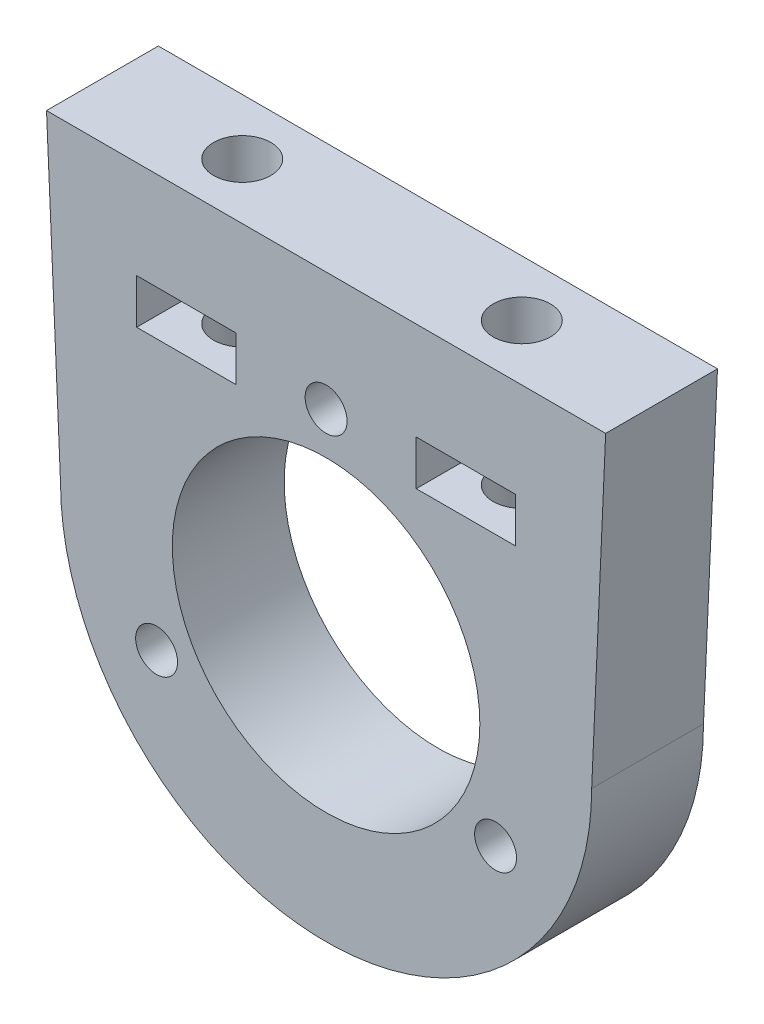
ISO-10303-21;
HEADER;
FILE_DESCRIPTION(('STEP AP214'),'2;1');
FILE_NAME('part.step','',(''),(''),'','','');
FILE_SCHEMA(('AUTOMOTIVE_DESIGN { 1 0 10303 214 1 1 1 1 }'));
ENDSEC;
DATA;
#1=APPLICATION_CONTEXT('core data for automotive mechanical design processes');
#2=APPLICATION_PROTOCOL_DEFINITION('international standard','automotive_design',2000,#1);
#3=PRODUCT_CONTEXT('',#1,'mechanical');
#4=PRODUCT('Part','Part','',(#3));
#5=PRODUCT_RELATED_PRODUCT_CATEGORY('part','',(#4));
#6=PRODUCT_DEFINITION_FORMATION('','',#4);
#7=PRODUCT_DEFINITION_CONTEXT('part definition',#1,'design');
#8=PRODUCT_DEFINITION('design','',#6,#7);
#9=PRODUCT_DEFINITION_SHAPE('','',#8);
#10=(LENGTH_UNIT() NAMED_UNIT(*) SI_UNIT(.MILLI.,.METRE.));
#11=(NAMED_UNIT(*) PLANE_ANGLE_UNIT() SI_UNIT($,.RADIAN.));
#12=(NAMED_UNIT(*) SI_UNIT($,.STERADIAN.) SOLID_ANGLE_UNIT());
#13=UNCERTAINTY_MEASURE_WITH_UNIT(LENGTH_MEASURE(1.E-05),#10,'distance_accuracy_value','');
#14=(GEOMETRIC_REPRESENTATION_CONTEXT(3) GLOBAL_UNCERTAINTY_ASSIGNED_CONTEXT((#13)) GLOBAL_UNIT_ASSIGNED_CONTEXT((#10,
#11,#12)) REPRESENTATION_CONTEXT('',''));
#15=CARTESIAN_POINT('',(0.,0.,0.));
#16=DIRECTION('',(0.,0.,1.));
#17=DIRECTION('',(1.,0.,0.));
#18=AXIS2_PLACEMENT_3D('',#15,#16,#17);
#19=CARTESIAN_POINT('',(0.,0.,8.));
#20=DIRECTION('',(0.,0.,1.));
#21=DIRECTION('',(1.,0.,0.));
#22=AXIS2_PLACEMENT_3D('',#19,#20,#21);
#23=PLANE('',#22);
#24=DIRECTION('',(0.,-1.,0.));
#25=VECTOR('',#24,1.);
#26=CARTESIAN_POINT('',(-13.55,15.5,8.));
#27=LINE('',#26,#25);
#28=CARTESIAN_POINT('',(-13.55,15.5,8.));
#29=VERTEX_POINT('',#28);
#30=CARTESIAN_POINT('',(-13.55,12.3,8.));
#31=VERTEX_POINT('',#30);
#32=EDGE_CURVE('E51',#29,#31,#27,.T.);
#33=ORIENTED_EDGE('',*,*,#32,.F.);
#34=DIRECTION('',(-1.,0.,0.));
#35=VECTOR('',#34,1.);
#36=CARTESIAN_POINT('',(-13.55,15.5,8.));
#37=LINE('',#36,#35);
#38=CARTESIAN_POINT('',(-6.45,15.5,8.));
#39=VERTEX_POINT('',#38);
#40=EDGE_CURVE('E146',#39,#29,#37,.T.);
#41=ORIENTED_EDGE('',*,*,#40,.F.);
#42=DIRECTION('',(0.,1.,0.));
#43=VECTOR('',#42,1.);
#44=CARTESIAN_POINT('',(-6.45,15.5,8.));
#45=LINE('',#44,#43);
#46=CARTESIAN_POINT('',(-6.45,12.3,8.));
#47=VERTEX_POINT('',#46);
#48=EDGE_CURVE('E149',#47,#39,#45,.T.);
#49=ORIENTED_EDGE('',*,*,#48,.F.);
#50=DIRECTION('',(1.,0.,0.));
#51=VECTOR('',#50,1.);
#52=CARTESIAN_POINT('',(-13.55,12.3,8.));
#53=LINE('',#52,#51);
#54=EDGE_CURVE('E158',#31,#47,#53,.T.);
#55=ORIENTED_EDGE('',*,*,#54,.F.);
#56=EDGE_LOOP('',(#33,#41,#49,#55));
#57=FACE_BOUND('',#56,.T.);
#58=DIRECTION('',(0.,-1.,0.));
#59=VECTOR('',#58,1.);
#60=CARTESIAN_POINT('',(6.45,12.3,8.));
#61=LINE('',#60,#59);
#62=CARTESIAN_POINT('',(6.45,15.5,8.));
#63=VERTEX_POINT('',#62);
#64=CARTESIAN_POINT('',(6.45,12.3,8.));
#65=VERTEX_POINT('',#64);
#66=EDGE_CURVE('E59',#63,#65,#61,.T.);
#67=ORIENTED_EDGE('',*,*,#66,.F.);
#68=DIRECTION('',(-1.,0.,0.));
#69=VECTOR('',#68,1.);
#70=CARTESIAN_POINT('',(13.55,15.5,8.));
#71=LINE('',#70,#69);
#72=CARTESIAN_POINT('',(13.55,15.5,8.));
#73=VERTEX_POINT('',#72);
#74=EDGE_CURVE('E173',#73,#63,#71,.T.);
#75=ORIENTED_EDGE('',*,*,#74,.F.);
#76=DIRECTION('',(0.,1.,0.));
#77=VECTOR('',#76,1.);
#78=CARTESIAN_POINT('',(13.55,12.3,8.));
#79=LINE('',#78,#77);
#80=CARTESIAN_POINT('',(13.55,12.3,8.));
#81=VERTEX_POINT('',#80);
#82=EDGE_CURVE('E187',#81,#73,#79,.T.);
#83=ORIENTED_EDGE('',*,*,#82,.F.);
#84=DIRECTION('',(1.,0.,0.));
#85=VECTOR('',#84,1.);
#86=CARTESIAN_POINT('',(13.55,12.3,8.));
#87=LINE('',#86,#85);
#88=EDGE_CURVE('E184',#65,#81,#87,.T.);
#89=ORIENTED_EDGE('',*,*,#88,.F.);
#90=EDGE_LOOP('',(#67,#75,#83,#89));
#91=FACE_BOUND('',#90,.T.);
#92=CARTESIAN_POINT('',(12.1243556529828,-6.99999999999963,8.));
#93=DIRECTION('',(0.,0.,1.));
#94=DIRECTION('',(1.,0.,0.));
#95=AXIS2_PLACEMENT_3D('',#92,#93,#94);
#96=CIRCLE('',#95,1.5);
#97=CARTESIAN_POINT('',(13.6243556529828,-6.99999999999963,8.));
#98=VERTEX_POINT('',#97);
#99=EDGE_CURVE('E204',#98,#98,#96,.T.);
#100=ORIENTED_EDGE('',*,*,#99,.F.);
#101=EDGE_LOOP('',(#100));
#102=FACE_BOUND('',#101,.T.);
#103=CARTESIAN_POINT('',(0.,14.,8.));
#104=DIRECTION('',(0.,0.,1.));
#105=DIRECTION('',(1.,0.,0.));
#106=AXIS2_PLACEMENT_3D('',#103,#104,#105);
#107=CIRCLE('',#106,1.5);
#108=CARTESIAN_POINT('',(1.5,14.,8.));
#109=VERTEX_POINT('',#108);
#110=EDGE_CURVE('E216',#109,#109,#107,.T.);
#111=ORIENTED_EDGE('',*,*,#110,.F.);
#112=EDGE_LOOP('',(#111));
#113=FACE_BOUND('',#112,.T.);
#114=CARTESIAN_POINT('',(0.,0.,8.));
#115=DIRECTION('',(0.,0.,1.));
#116=DIRECTION('',(1.,0.,0.));
#117=AXIS2_PLACEMENT_3D('',#114,#115,#116);
#118=CIRCLE('',#117,19.);
#119=CARTESIAN_POINT('',(-19.,0.,8.));
#120=VERTEX_POINT('',#119);
#121=CARTESIAN_POINT('',(19.,0.,8.));
#122=VERTEX_POINT('',#121);
#123=EDGE_CURVE('E222',#120,#122,#118,.T.);
#124=ORIENTED_EDGE('',*,*,#123,.T.);
#125=DIRECTION('',(0.0444006136207203,0.999013806466209,0.));
#126=VECTOR('',#125,1.);
#127=CARTESIAN_POINT('',(20.,22.5,8.));
#128=LINE('',#127,#126);
#129=CARTESIAN_POINT('',(20.,22.5,8.));
#130=VERTEX_POINT('',#129);
#131=EDGE_CURVE('E225',#122,#130,#128,.T.);
#132=ORIENTED_EDGE('',*,*,#131,.T.);
#133=DIRECTION('',(-1.,0.,0.));
#134=VECTOR('',#133,1.);
#135=CARTESIAN_POINT('',(-20.,22.5,8.));
#136=LINE('',#135,#134);
#137=CARTESIAN_POINT('',(-20.,22.5,8.));
#138=VERTEX_POINT('',#137);
#139=EDGE_CURVE('E228',#130,#138,#136,.T.);
#140=ORIENTED_EDGE('',*,*,#139,.T.);
#141=DIRECTION('',(0.0444006136207206,-0.999013806466209,0.));
#142=VECTOR('',#141,1.);
#143=CARTESIAN_POINT('',(-19.,0.,8.));
#144=LINE('',#143,#142);
#145=EDGE_CURVE('E230',#138,#120,#144,.T.);
#146=ORIENTED_EDGE('',*,*,#145,.T.);
#147=EDGE_LOOP('',(#124,#132,#140,#146));
#148=FACE_BOUND('',#147,.T.);
#149=CARTESIAN_POINT('',(0.,0.,8.));
#150=DIRECTION('',(0.,0.,1.));
#151=DIRECTION('',(1.,0.,0.));
#152=AXIS2_PLACEMENT_3D('',#149,#150,#151);
#153=CIRCLE('',#152,11.);
#154=CARTESIAN_POINT('',(11.,0.,8.));
#155=VERTEX_POINT('',#154);
#156=EDGE_CURVE('E210',#155,#155,#153,.T.);
#157=ORIENTED_EDGE('',*,*,#156,.F.);
#158=EDGE_LOOP('',(#157));
#159=FACE_BOUND('',#158,.T.);
#160=CARTESIAN_POINT('',(-12.1243556529815,-7.00000000000037,8.));
#161=DIRECTION('',(0.,0.,1.));
#162=DIRECTION('',(1.,0.,0.));
#163=AXIS2_PLACEMENT_3D('',#160,#161,#162);
#164=CIRCLE('',#163,1.5);
#165=CARTESIAN_POINT('',(-10.6243556529815,-7.00000000000037,8.));
#166=VERTEX_POINT('',#165);
#167=EDGE_CURVE('E198',#166,#166,#164,.T.);
#168=ORIENTED_EDGE('',*,*,#167,.F.);
#169=EDGE_LOOP('',(#168));
#170=FACE_BOUND('',#169,.T.);
#171=ADVANCED_FACE('F34',(#57,#91,#102,#113,#148,#159,#170),#23,.T.);
#172=CARTESIAN_POINT('',(0.,0.,0.));
#173=DIRECTION('',(0.,0.,1.));
#174=DIRECTION('',(1.,0.,0.));
#175=AXIS2_PLACEMENT_3D('',#172,#173,#174);
#176=PLANE('',#175);
#177=DIRECTION('',(-1.,0.,0.));
#178=VECTOR('',#177,1.);
#179=CARTESIAN_POINT('',(-13.55,15.5,0.));
#180=LINE('',#179,#178);
#181=CARTESIAN_POINT('',(-6.45,15.5,0.));
#182=VERTEX_POINT('',#181);
#183=CARTESIAN_POINT('',(-13.55,15.5,0.));
#184=VERTEX_POINT('',#183);
#185=EDGE_CURVE('E133',#182,#184,#180,.T.);
#186=ORIENTED_EDGE('',*,*,#185,.T.);
#187=DIRECTION('',(0.,-1.,0.));
#188=VECTOR('',#187,1.);
#189=CARTESIAN_POINT('',(-13.55,15.5,0.));
#190=LINE('',#189,#188);
#191=CARTESIAN_POINT('',(-13.55,12.3,0.));
#192=VERTEX_POINT('',#191);
#193=EDGE_CURVE('E127',#184,#192,#190,.T.);
#194=ORIENTED_EDGE('',*,*,#193,.T.);
#195=DIRECTION('',(1.,0.,0.));
#196=VECTOR('',#195,1.);
#197=CARTESIAN_POINT('',(-13.55,12.3,0.));
#198=LINE('',#197,#196);
#199=CARTESIAN_POINT('',(-6.45,12.3,0.));
#200=VERTEX_POINT('',#199);
#201=EDGE_CURVE('E137',#192,#200,#198,.T.);
#202=ORIENTED_EDGE('',*,*,#201,.T.);
#203=DIRECTION('',(0.,1.,0.));
#204=VECTOR('',#203,1.);
#205=CARTESIAN_POINT('',(-6.45,15.5,0.));
#206=LINE('',#205,#204);
#207=EDGE_CURVE('E141',#200,#182,#206,.T.);
#208=ORIENTED_EDGE('',*,*,#207,.T.);
#209=EDGE_LOOP('',(#186,#194,#202,#208));
#210=FACE_BOUND('',#209,.T.);
#211=DIRECTION('',(-1.,0.,0.));
#212=VECTOR('',#211,1.);
#213=CARTESIAN_POINT('',(13.55,15.5,0.));
#214=LINE('',#213,#212);
#215=CARTESIAN_POINT('',(13.55,15.5,0.));
#216=VERTEX_POINT('',#215);
#217=CARTESIAN_POINT('',(6.45,15.5,0.));
#218=VERTEX_POINT('',#217);
#219=EDGE_CURVE('E179',#216,#218,#214,.T.);
#220=ORIENTED_EDGE('',*,*,#219,.T.);
#221=DIRECTION('',(0.,-1.,0.));
#222=VECTOR('',#221,1.);
#223=CARTESIAN_POINT('',(6.45,12.3,0.));
#224=LINE('',#223,#222);
#225=CARTESIAN_POINT('',(6.45,12.3,0.));
#226=VERTEX_POINT('',#225);
#227=EDGE_CURVE('E169',#218,#226,#224,.T.);
#228=ORIENTED_EDGE('',*,*,#227,.T.);
#229=DIRECTION('',(1.,0.,0.));
#230=VECTOR('',#229,1.);
#231=CARTESIAN_POINT('',(13.55,12.3,0.));
#232=LINE('',#231,#230);
#233=CARTESIAN_POINT('',(13.55,12.3,0.));
#234=VERTEX_POINT('',#233);
#235=EDGE_CURVE('E172',#226,#234,#232,.T.);
#236=ORIENTED_EDGE('',*,*,#235,.T.);
#237=DIRECTION('',(0.,1.,0.));
#238=VECTOR('',#237,1.);
#239=CARTESIAN_POINT('',(13.55,12.3,0.));
#240=LINE('',#239,#238);
#241=EDGE_CURVE('E176',#234,#216,#240,.T.);
#242=ORIENTED_EDGE('',*,*,#241,.T.);
#243=EDGE_LOOP('',(#220,#228,#236,#242));
#244=FACE_BOUND('',#243,.T.);
#245=CARTESIAN_POINT('',(0.,0.,0.));
#246=DIRECTION('',(0.,0.,1.));
#247=DIRECTION('',(1.,0.,0.));
#248=AXIS2_PLACEMENT_3D('',#245,#246,#247);
#249=CIRCLE('',#248,19.);
#250=CARTESIAN_POINT('',(-19.,0.,0.));
#251=VERTEX_POINT('',#250);
#252=CARTESIAN_POINT('',(19.,0.,0.));
#253=VERTEX_POINT('',#252);
#254=EDGE_CURVE('E219',#251,#253,#249,.T.);
#255=ORIENTED_EDGE('',*,*,#254,.F.);
#256=DIRECTION('',(0.0444006136207206,-0.999013806466209,0.));
#257=VECTOR('',#256,1.);
#258=CARTESIAN_POINT('',(-19.,0.,0.));
#259=LINE('',#258,#257);
#260=CARTESIAN_POINT('',(-20.,22.5,0.));
#261=VERTEX_POINT('',#260);
#262=EDGE_CURVE('E226',#261,#251,#259,.T.);
#263=ORIENTED_EDGE('',*,*,#262,.F.);
#264=DIRECTION('',(-1.,0.,0.));
#265=VECTOR('',#264,1.);
#266=CARTESIAN_POINT('',(-20.,22.5,0.));
#267=LINE('',#266,#265);
#268=CARTESIAN_POINT('',(20.,22.5,0.));
#269=VERTEX_POINT('',#268);
#270=EDGE_CURVE('E237',#269,#261,#267,.T.);
#271=ORIENTED_EDGE('',*,*,#270,.F.);
#272=DIRECTION('',(0.0444006136207203,0.999013806466209,0.));
#273=VECTOR('',#272,1.);
#274=CARTESIAN_POINT('',(20.,22.5,0.));
#275=LINE('',#274,#273);
#276=EDGE_CURVE('E235',#253,#269,#275,.T.);
#277=ORIENTED_EDGE('',*,*,#276,.F.);
#278=EDGE_LOOP('',(#255,#263,#271,#277));
#279=FACE_BOUND('',#278,.T.);
#280=CARTESIAN_POINT('',(0.,14.,0.));
#281=DIRECTION('',(0.,0.,1.));
#282=DIRECTION('',(1.,0.,0.));
#283=AXIS2_PLACEMENT_3D('',#280,#281,#282);
#284=CIRCLE('',#283,1.5);
#285=CARTESIAN_POINT('',(1.5,14.,0.));
#286=VERTEX_POINT('',#285);
#287=EDGE_CURVE('E213',#286,#286,#284,.T.);
#288=ORIENTED_EDGE('',*,*,#287,.T.);
#289=EDGE_LOOP('',(#288));
#290=FACE_BOUND('',#289,.T.);
#291=CARTESIAN_POINT('',(0.,0.,0.));
#292=DIRECTION('',(0.,0.,1.));
#293=DIRECTION('',(1.,0.,0.));
#294=AXIS2_PLACEMENT_3D('',#291,#292,#293);
#295=CIRCLE('',#294,11.);
#296=CARTESIAN_POINT('',(11.,0.,0.));
#297=VERTEX_POINT('',#296);
#298=EDGE_CURVE('E207',#297,#297,#295,.T.);
#299=ORIENTED_EDGE('',*,*,#298,.T.);
#300=EDGE_LOOP('',(#299));
#301=FACE_BOUND('',#300,.T.);
#302=CARTESIAN_POINT('',(12.1243556529828,-6.99999999999963,0.));
#303=DIRECTION('',(0.,0.,1.));
#304=DIRECTION('',(1.,0.,0.));
#305=AXIS2_PLACEMENT_3D('',#302,#303,#304);
#306=CIRCLE('',#305,1.5);
#307=CARTESIAN_POINT('',(13.6243556529828,-6.99999999999963,0.));
#308=VERTEX_POINT('',#307);
#309=EDGE_CURVE('E201',#308,#308,#306,.T.);
#310=ORIENTED_EDGE('',*,*,#309,.T.);
#311=EDGE_LOOP('',(#310));
#312=FACE_BOUND('',#311,.T.);
#313=CARTESIAN_POINT('',(-12.1243556529815,-7.00000000000037,0.));
#314=DIRECTION('',(0.,0.,1.));
#315=DIRECTION('',(1.,0.,0.));
#316=AXIS2_PLACEMENT_3D('',#313,#314,#315);
#317=CIRCLE('',#316,1.5);
#318=CARTESIAN_POINT('',(-10.6243556529815,-7.00000000000037,0.));
#319=VERTEX_POINT('',#318);
#320=EDGE_CURVE('E165',#319,#319,#317,.T.);
#321=ORIENTED_EDGE('',*,*,#320,.T.);
#322=EDGE_LOOP('',(#321));
#323=FACE_BOUND('',#322,.T.);
#324=ADVANCED_FACE('F143',(#210,#244,#279,#290,#301,#312,#323),#176,.F.);
#325=CARTESIAN_POINT('',(0.,0.,8.));
#326=DIRECTION('',(0.,0.,-1.));
#327=DIRECTION('',(-1.,0.,0.));
#328=AXIS2_PLACEMENT_3D('',#325,#326,#327);
#329=CYLINDRICAL_SURFACE('',#328,19.);
#330=ORIENTED_EDGE('',*,*,#254,.T.);
#331=DIRECTION('',(0.,0.,-1.));
#332=VECTOR('',#331,1.);
#333=CARTESIAN_POINT('',(19.,0.,8.));
#334=LINE('',#333,#332);
#335=EDGE_CURVE('E11',#122,#253,#334,.T.);
#336=ORIENTED_EDGE('',*,*,#335,.F.);
#337=ORIENTED_EDGE('',*,*,#123,.F.);
#338=DIRECTION('',(0.,0.,-1.));
#339=VECTOR('',#338,1.);
#340=CARTESIAN_POINT('',(-19.,0.,8.));
#341=LINE('',#340,#339);
#342=EDGE_CURVE('E232',#120,#251,#341,.T.);
#343=ORIENTED_EDGE('',*,*,#342,.T.);
#344=EDGE_LOOP('',(#330,#336,#337,#343));
#345=FACE_BOUND('',#344,.T.);
#346=ADVANCED_FACE('F36',(#345),#329,.T.);
#347=CARTESIAN_POINT('',(20.,22.5,8.));
#348=DIRECTION('',(-0.999013806466209,0.0444006136207203,0.));
#349=DIRECTION('',(-0.0444006136207203,-0.999013806466209,0.));
#350=AXIS2_PLACEMENT_3D('',#347,#348,#349);
#351=PLANE('',#350);
#352=ORIENTED_EDGE('',*,*,#276,.T.);
#353=DIRECTION('',(0.,0.,-1.));
#354=VECTOR('',#353,1.);
#355=CARTESIAN_POINT('',(20.,22.5,8.));
#356=LINE('',#355,#354);
#357=EDGE_CURVE('E43',#130,#269,#356,.T.);
#358=ORIENTED_EDGE('',*,*,#357,.F.);
#359=ORIENTED_EDGE('',*,*,#131,.F.);
#360=ORIENTED_EDGE('',*,*,#335,.T.);
#361=EDGE_LOOP('',(#352,#358,#359,#360));
#362=FACE_BOUND('',#361,.T.);
#363=ADVANCED_FACE('F275',(#362),#351,.F.);
#364=CARTESIAN_POINT('',(-20.,22.5,8.));
#365=DIRECTION('',(0.,-1.,0.));
#366=DIRECTION('',(0.,0.,-1.));
#367=AXIS2_PLACEMENT_3D('',#364,#365,#366);
#368=PLANE('',#367);
#369=CARTESIAN_POINT('',(-10.,22.5,4.));
#370=DIRECTION('',(0.,1.,0.));
#371=DIRECTION('',(-1.,0.,0.));
#372=AXIS2_PLACEMENT_3D('',#369,#370,#371);
#373=CIRCLE('',#372,2.05);
#374=CARTESIAN_POINT('',(-12.05,22.5,4.));
#375=VERTEX_POINT('',#374);
#376=EDGE_CURVE('E254',#375,#375,#373,.T.);
#377=ORIENTED_EDGE('',*,*,#376,.F.);
#378=EDGE_LOOP('',(#377));
#379=FACE_BOUND('',#378,.T.);
#380=CARTESIAN_POINT('',(10.,22.5,4.));
#381=DIRECTION('',(0.,1.,0.));
#382=DIRECTION('',(-1.,0.,0.));
#383=AXIS2_PLACEMENT_3D('',#380,#381,#382);
#384=CIRCLE('',#383,2.05);
#385=CARTESIAN_POINT('',(7.95,22.5,4.));
#386=VERTEX_POINT('',#385);
#387=EDGE_CURVE('E264',#386,#386,#384,.T.);
#388=ORIENTED_EDGE('',*,*,#387,.F.);
#389=EDGE_LOOP('',(#388));
#390=FACE_BOUND('',#389,.T.);
#391=ORIENTED_EDGE('',*,*,#270,.T.);
#392=DIRECTION('',(0.,0.,-1.));
#393=VECTOR('',#392,1.);
#394=CARTESIAN_POINT('',(-20.,22.5,8.));
#395=LINE('',#394,#393);
#396=EDGE_CURVE('E242',#138,#261,#395,.T.);
#397=ORIENTED_EDGE('',*,*,#396,.F.);
#398=ORIENTED_EDGE('',*,*,#139,.F.);
#399=ORIENTED_EDGE('',*,*,#357,.T.);
#400=EDGE_LOOP('',(#391,#397,#398,#399));
#401=FACE_BOUND('',#400,.T.);
#402=ADVANCED_FACE('F271',(#379,#390,#401),#368,.F.);
#403=CARTESIAN_POINT('',(-19.,0.,8.));
#404=DIRECTION('',(0.999013806466209,0.0444006136207206,0.));
#405=DIRECTION('',(-0.0444006136207206,0.999013806466209,0.));
#406=AXIS2_PLACEMENT_3D('',#403,#404,#405);
#407=PLANE('',#406);
#408=ORIENTED_EDGE('',*,*,#262,.T.);
#409=ORIENTED_EDGE('',*,*,#342,.F.);
#410=ORIENTED_EDGE('',*,*,#145,.F.);
#411=ORIENTED_EDGE('',*,*,#396,.T.);
#412=EDGE_LOOP('',(#408,#409,#410,#411));
#413=FACE_BOUND('',#412,.T.);
#414=ADVANCED_FACE('F274',(#413),#407,.F.);
#415=CARTESIAN_POINT('',(0.,14.,8.));
#416=DIRECTION('',(0.,0.,-1.));
#417=DIRECTION('',(-1.,0.,0.));
#418=AXIS2_PLACEMENT_3D('',#415,#416,#417);
#419=CYLINDRICAL_SURFACE('',#418,1.5);
#420=ORIENTED_EDGE('',*,*,#110,.T.);
#421=EDGE_LOOP('',(#420));
#422=FACE_BOUND('',#421,.T.);
#423=ORIENTED_EDGE('',*,*,#287,.F.);
#424=EDGE_LOOP('',(#423));
#425=FACE_BOUND('',#424,.T.);
#426=ADVANCED_FACE('F308',(#422,#425),#419,.F.);
#427=CARTESIAN_POINT('',(0.,0.,8.));
#428=DIRECTION('',(0.,0.,-1.));
#429=DIRECTION('',(-1.,0.,0.));
#430=AXIS2_PLACEMENT_3D('',#427,#428,#429);
#431=CYLINDRICAL_SURFACE('',#430,11.);
#432=ORIENTED_EDGE('',*,*,#156,.T.);
#433=EDGE_LOOP('',(#432));
#434=FACE_BOUND('',#433,.T.);
#435=ORIENTED_EDGE('',*,*,#298,.F.);
#436=EDGE_LOOP('',(#435));
#437=FACE_BOUND('',#436,.T.);
#438=ADVANCED_FACE('F315',(#434,#437),#431,.F.);
#439=CARTESIAN_POINT('',(12.1243556529828,-6.99999999999963,8.));
#440=DIRECTION('',(0.,0.,-1.));
#441=DIRECTION('',(-1.,0.,0.));
#442=AXIS2_PLACEMENT_3D('',#439,#440,#441);
#443=CYLINDRICAL_SURFACE('',#442,1.5);
#444=ORIENTED_EDGE('',*,*,#99,.T.);
#445=EDGE_LOOP('',(#444));
#446=FACE_BOUND('',#445,.T.);
#447=ORIENTED_EDGE('',*,*,#309,.F.);
#448=EDGE_LOOP('',(#447));
#449=FACE_BOUND('',#448,.T.);
#450=ADVANCED_FACE('F320',(#446,#449),#443,.F.);
#451=CARTESIAN_POINT('',(-12.1243556529815,-7.00000000000037,8.));
#452=DIRECTION('',(0.,0.,-1.));
#453=DIRECTION('',(-1.,0.,0.));
#454=AXIS2_PLACEMENT_3D('',#451,#452,#453);
#455=CYLINDRICAL_SURFACE('',#454,1.5);
#456=ORIENTED_EDGE('',*,*,#167,.T.);
#457=EDGE_LOOP('',(#456));
#458=FACE_BOUND('',#457,.T.);
#459=ORIENTED_EDGE('',*,*,#320,.F.);
#460=EDGE_LOOP('',(#459));
#461=FACE_BOUND('',#460,.T.);
#462=ADVANCED_FACE('F332',(#458,#461),#455,.F.);
#463=CARTESIAN_POINT('',(6.45,12.3,0.));
#464=DIRECTION('',(-1.,0.,0.));
#465=DIRECTION('',(0.,0.,1.));
#466=AXIS2_PLACEMENT_3D('',#463,#464,#465);
#467=PLANE('',#466);
#468=ORIENTED_EDGE('',*,*,#66,.T.);
#469=DIRECTION('',(0.,0.,1.));
#470=VECTOR('',#469,1.);
#471=CARTESIAN_POINT('',(6.45,12.3,0.));
#472=LINE('',#471,#470);
#473=EDGE_CURVE('E182',#226,#65,#472,.T.);
#474=ORIENTED_EDGE('',*,*,#473,.F.);
#475=ORIENTED_EDGE('',*,*,#227,.F.);
#476=DIRECTION('',(0.,0.,1.));
#477=VECTOR('',#476,1.);
#478=CARTESIAN_POINT('',(6.45,15.5,0.));
#479=LINE('',#478,#477);
#480=EDGE_CURVE('E159',#218,#63,#479,.T.);
#481=ORIENTED_EDGE('',*,*,#480,.T.);
#482=EDGE_LOOP('',(#468,#474,#475,#481));
#483=FACE_BOUND('',#482,.T.);
#484=ADVANCED_FACE('F334',(#483),#467,.F.);
#485=CARTESIAN_POINT('',(13.55,15.5,0.));
#486=DIRECTION('',(0.,1.,0.));
#487=DIRECTION('',(-1.,0.,0.));
#488=AXIS2_PLACEMENT_3D('',#485,#486,#487);
#489=PLANE('',#488);
#490=CARTESIAN_POINT('',(10.,15.5,4.));
#491=DIRECTION('',(0.,1.,0.));
#492=DIRECTION('',(-1.,0.,0.));
#493=AXIS2_PLACEMENT_3D('',#490,#491,#492);
#494=CIRCLE('',#493,2.05);
#495=CARTESIAN_POINT('',(7.95,15.5,4.));
#496=VERTEX_POINT('',#495);
#497=EDGE_CURVE('E152',#496,#496,#494,.T.);
#498=ORIENTED_EDGE('',*,*,#497,.T.);
#499=EDGE_LOOP('',(#498));
#500=FACE_BOUND('',#499,.T.);
#501=ORIENTED_EDGE('',*,*,#74,.T.);
#502=ORIENTED_EDGE('',*,*,#480,.F.);
#503=ORIENTED_EDGE('',*,*,#219,.F.);
#504=DIRECTION('',(0.,0.,1.));
#505=VECTOR('',#504,1.);
#506=CARTESIAN_POINT('',(13.55,15.5,0.));
#507=LINE('',#506,#505);
#508=EDGE_CURVE('E193',#216,#73,#507,.T.);
#509=ORIENTED_EDGE('',*,*,#508,.T.);
#510=EDGE_LOOP('',(#501,#502,#503,#509));
#511=FACE_BOUND('',#510,.T.);
#512=ADVANCED_FACE('F341',(#500,#511),#489,.F.);
#513=CARTESIAN_POINT('',(13.55,12.3,0.));
#514=DIRECTION('',(1.,0.,0.));
#515=DIRECTION('',(0.,1.,0.));
#516=AXIS2_PLACEMENT_3D('',#513,#514,#515);
#517=PLANE('',#516);
#518=ORIENTED_EDGE('',*,*,#82,.T.);
#519=ORIENTED_EDGE('',*,*,#508,.F.);
#520=ORIENTED_EDGE('',*,*,#241,.F.);
#521=DIRECTION('',(0.,0.,1.));
#522=VECTOR('',#521,1.);
#523=CARTESIAN_POINT('',(13.55,12.3,0.));
#524=LINE('',#523,#522);
#525=EDGE_CURVE('E195',#234,#81,#524,.T.);
#526=ORIENTED_EDGE('',*,*,#525,.T.);
#527=EDGE_LOOP('',(#518,#519,#520,#526));
#528=FACE_BOUND('',#527,.T.);
#529=ADVANCED_FACE('F349',(#528),#517,.F.);
#530=CARTESIAN_POINT('',(13.55,12.3,0.));
#531=DIRECTION('',(0.,-1.,0.));
#532=DIRECTION('',(1.,0.,0.));
#533=AXIS2_PLACEMENT_3D('',#530,#531,#532);
#534=PLANE('',#533);
#535=CARTESIAN_POINT('',(10.,12.3,4.));
#536=DIRECTION('',(0.,-1.,0.));
#537=DIRECTION('',(1.,0.,0.));
#538=AXIS2_PLACEMENT_3D('',#535,#536,#537);
#539=CIRCLE('',#538,2.05);
#540=CARTESIAN_POINT('',(12.05,12.3,4.));
#541=VERTEX_POINT('',#540);
#542=EDGE_CURVE('E38',#541,#541,#539,.T.);
#543=ORIENTED_EDGE('',*,*,#542,.T.);
#544=EDGE_LOOP('',(#543));
#545=FACE_BOUND('',#544,.T.);
#546=ORIENTED_EDGE('',*,*,#88,.T.);
#547=ORIENTED_EDGE('',*,*,#525,.F.);
#548=ORIENTED_EDGE('',*,*,#235,.F.);
#549=ORIENTED_EDGE('',*,*,#473,.T.);
#550=EDGE_LOOP('',(#546,#547,#548,#549));
#551=FACE_BOUND('',#550,.T.);
#552=ADVANCED_FACE('F346',(#545,#551),#534,.F.);
#553=CARTESIAN_POINT('',(-13.55,15.5,0.));
#554=DIRECTION('',(-1.,0.,0.));
#555=DIRECTION('',(0.,-1.,0.));
#556=AXIS2_PLACEMENT_3D('',#553,#554,#555);
#557=PLANE('',#556);
#558=ORIENTED_EDGE('',*,*,#32,.T.);
#559=DIRECTION('',(0.,0.,1.));
#560=VECTOR('',#559,1.);
#561=CARTESIAN_POINT('',(-13.55,12.3,0.));
#562=LINE('',#561,#560);
#563=EDGE_CURVE('E123',#192,#31,#562,.T.);
#564=ORIENTED_EDGE('',*,*,#563,.F.);
#565=ORIENTED_EDGE('',*,*,#193,.F.);
#566=DIRECTION('',(0.,0.,1.));
#567=VECTOR('',#566,1.);
#568=CARTESIAN_POINT('',(-13.55,15.5,0.));
#569=LINE('',#568,#567);
#570=EDGE_CURVE('E163',#184,#29,#569,.T.);
#571=ORIENTED_EDGE('',*,*,#570,.T.);
#572=EDGE_LOOP('',(#558,#564,#565,#571));
#573=FACE_BOUND('',#572,.T.);
#574=ADVANCED_FACE('F125',(#573),#557,.F.);
#575=CARTESIAN_POINT('',(-13.55,15.5,0.));
#576=DIRECTION('',(0.,1.,0.));
#577=DIRECTION('',(0.,0.,1.));
#578=AXIS2_PLACEMENT_3D('',#575,#576,#577);
#579=PLANE('',#578);
#580=CARTESIAN_POINT('',(-10.,15.5,4.));
#581=DIRECTION('',(0.,1.,0.));
#582=DIRECTION('',(0.,0.,1.));
#583=AXIS2_PLACEMENT_3D('',#580,#581,#582);
#584=CIRCLE('',#583,2.05);
#585=CARTESIAN_POINT('',(-10.,15.5,6.05));
#586=VERTEX_POINT('',#585);
#587=EDGE_CURVE('E248',#586,#586,#584,.T.);
#588=ORIENTED_EDGE('',*,*,#587,.T.);
#589=EDGE_LOOP('',(#588));
#590=FACE_BOUND('',#589,.T.);
#591=ORIENTED_EDGE('',*,*,#40,.T.);
#592=ORIENTED_EDGE('',*,*,#570,.F.);
#593=ORIENTED_EDGE('',*,*,#185,.F.);
#594=DIRECTION('',(0.,0.,1.));
#595=VECTOR('',#594,1.);
#596=CARTESIAN_POINT('',(-6.45,15.5,0.));
#597=LINE('',#596,#595);
#598=EDGE_CURVE('E166',#182,#39,#597,.T.);
#599=ORIENTED_EDGE('',*,*,#598,.T.);
#600=EDGE_LOOP('',(#591,#592,#593,#599));
#601=FACE_BOUND('',#600,.T.);
#602=ADVANCED_FACE('F359',(#590,#601),#579,.F.);
#603=CARTESIAN_POINT('',(-6.45,15.5,0.));
#604=DIRECTION('',(1.,0.,0.));
#605=DIRECTION('',(0.,0.,-1.));
#606=AXIS2_PLACEMENT_3D('',#603,#604,#605);
#607=PLANE('',#606);
#608=ORIENTED_EDGE('',*,*,#48,.T.);
#609=ORIENTED_EDGE('',*,*,#598,.F.);
#610=ORIENTED_EDGE('',*,*,#207,.F.);
#611=DIRECTION('',(0.,0.,1.));
#612=VECTOR('',#611,1.);
#613=CARTESIAN_POINT('',(-6.45,12.3,0.));
#614=LINE('',#613,#612);
#615=EDGE_CURVE('E132',#200,#47,#614,.T.);
#616=ORIENTED_EDGE('',*,*,#615,.T.);
#617=EDGE_LOOP('',(#608,#609,#610,#616));
#618=FACE_BOUND('',#617,.T.);
#619=ADVANCED_FACE('F363',(#618),#607,.F.);
#620=CARTESIAN_POINT('',(-13.55,12.3,0.));
#621=DIRECTION('',(0.,-1.,0.));
#622=DIRECTION('',(1.,0.,0.));
#623=AXIS2_PLACEMENT_3D('',#620,#621,#622);
#624=PLANE('',#623);
#625=CARTESIAN_POINT('',(-10.,12.3,4.));
#626=DIRECTION('',(0.,-1.,0.));
#627=DIRECTION('',(1.,0.,0.));
#628=AXIS2_PLACEMENT_3D('',#625,#626,#627);
#629=CIRCLE('',#628,2.05);
#630=CARTESIAN_POINT('',(-7.95,12.3,4.));
#631=VERTEX_POINT('',#630);
#632=EDGE_CURVE('E246',#631,#631,#629,.T.);
#633=ORIENTED_EDGE('',*,*,#632,.T.);
#634=EDGE_LOOP('',(#633));
#635=FACE_BOUND('',#634,.T.);
#636=ORIENTED_EDGE('',*,*,#54,.T.);
#637=ORIENTED_EDGE('',*,*,#615,.F.);
#638=ORIENTED_EDGE('',*,*,#201,.F.);
#639=ORIENTED_EDGE('',*,*,#563,.T.);
#640=EDGE_LOOP('',(#636,#637,#638,#639));
#641=FACE_BOUND('',#640,.T.);
#642=ADVANCED_FACE('F138',(#635,#641),#624,.F.);
#643=CARTESIAN_POINT('',(-10.,8.5,4.));
#644=DIRECTION('',(0.,1.,0.));
#645=DIRECTION('',(-1.,0.,0.));
#646=AXIS2_PLACEMENT_3D('',#643,#644,#645);
#647=PLANE('',#646);
#648=CARTESIAN_POINT('',(-10.,8.5,4.));
#649=DIRECTION('',(0.,1.,0.));
#650=DIRECTION('',(-1.,0.,0.));
#651=AXIS2_PLACEMENT_3D('',#648,#649,#650);
#652=CIRCLE('',#651,2.05);
#653=CARTESIAN_POINT('',(-12.05,8.5,4.));
#654=VERTEX_POINT('',#653);
#655=EDGE_CURVE('E249',#654,#654,#652,.T.);
#656=ORIENTED_EDGE('',*,*,#655,.T.);
#657=EDGE_LOOP('',(#656));
#658=FACE_BOUND('',#657,.T.);
#659=ADVANCED_FACE('F362',(#658),#647,.T.);
#660=CARTESIAN_POINT('',(-10.,8.5,4.));
#661=DIRECTION('',(0.,1.,0.));
#662=DIRECTION('',(-1.,0.,0.));
#663=AXIS2_PLACEMENT_3D('',#660,#661,#662);
#664=CYLINDRICAL_SURFACE('',#663,2.05);
#665=ORIENTED_EDGE('',*,*,#655,.F.);
#666=EDGE_LOOP('',(#665));
#667=FACE_BOUND('',#666,.T.);
#668=ORIENTED_EDGE('',*,*,#632,.F.);
#669=EDGE_LOOP('',(#668));
#670=FACE_BOUND('',#669,.T.);
#671=ADVANCED_FACE('F380',(#667,#670),#664,.F.);
#672=ORIENTED_EDGE('',*,*,#376,.T.);
#673=EDGE_LOOP('',(#672));
#674=FACE_BOUND('',#673,.T.);
#675=ORIENTED_EDGE('',*,*,#587,.F.);
#676=EDGE_LOOP('',(#675));
#677=FACE_BOUND('',#676,.T.);
#678=ADVANCED_FACE('F376',(#674,#677),#664,.F.);
#679=CARTESIAN_POINT('',(10.,8.5,4.));
#680=DIRECTION('',(0.,1.,0.));
#681=DIRECTION('',(-1.,0.,0.));
#682=AXIS2_PLACEMENT_3D('',#679,#680,#681);
#683=PLANE('',#682);
#684=CARTESIAN_POINT('',(10.,8.5,4.));
#685=DIRECTION('',(0.,1.,0.));
#686=DIRECTION('',(-1.,0.,0.));
#687=AXIS2_PLACEMENT_3D('',#684,#685,#686);
#688=CIRCLE('',#687,2.05);
#689=CARTESIAN_POINT('',(7.95,8.5,4.));
#690=VERTEX_POINT('',#689);
#691=EDGE_CURVE('E259',#690,#690,#688,.T.);
#692=ORIENTED_EDGE('',*,*,#691,.T.);
#693=EDGE_LOOP('',(#692));
#694=FACE_BOUND('',#693,.T.);
#695=ADVANCED_FACE('F373',(#694),#683,.T.);
#696=CARTESIAN_POINT('',(10.,8.5,4.));
#697=DIRECTION('',(0.,1.,0.));
#698=DIRECTION('',(-1.,0.,0.));
#699=AXIS2_PLACEMENT_3D('',#696,#697,#698);
#700=CYLINDRICAL_SURFACE('',#699,2.05);
#701=ORIENTED_EDGE('',*,*,#691,.F.);
#702=EDGE_LOOP('',(#701));
#703=FACE_BOUND('',#702,.T.);
#704=ORIENTED_EDGE('',*,*,#542,.F.);
#705=EDGE_LOOP('',(#704));
#706=FACE_BOUND('',#705,.T.);
#707=ADVANCED_FACE('F372',(#703,#706),#700,.F.);
#708=ORIENTED_EDGE('',*,*,#387,.T.);
#709=EDGE_LOOP('',(#708));
#710=FACE_BOUND('',#709,.T.);
#711=ORIENTED_EDGE('',*,*,#497,.F.);
#712=EDGE_LOOP('',(#711));
#713=FACE_BOUND('',#712,.T.);
#714=ADVANCED_FACE('F268',(#710,#713),#700,.F.);
#715=CLOSED_SHELL('',(#171,#324,#346,#363,#402,#414,#426,#438,#450,#462,#484,#512,#529,#552,
#574,#602,#619,#642,#659,#671,#678,#695,#707,#714));
#716=MANIFOLD_SOLID_BREP('B2',#715);
#717=ADVANCED_BREP_SHAPE_REPRESENTATION('',(#18,#716),#14);
#718=SHAPE_DEFINITION_REPRESENTATION(#9,#717);
ENDSEC;
END-ISO-10303-21;
